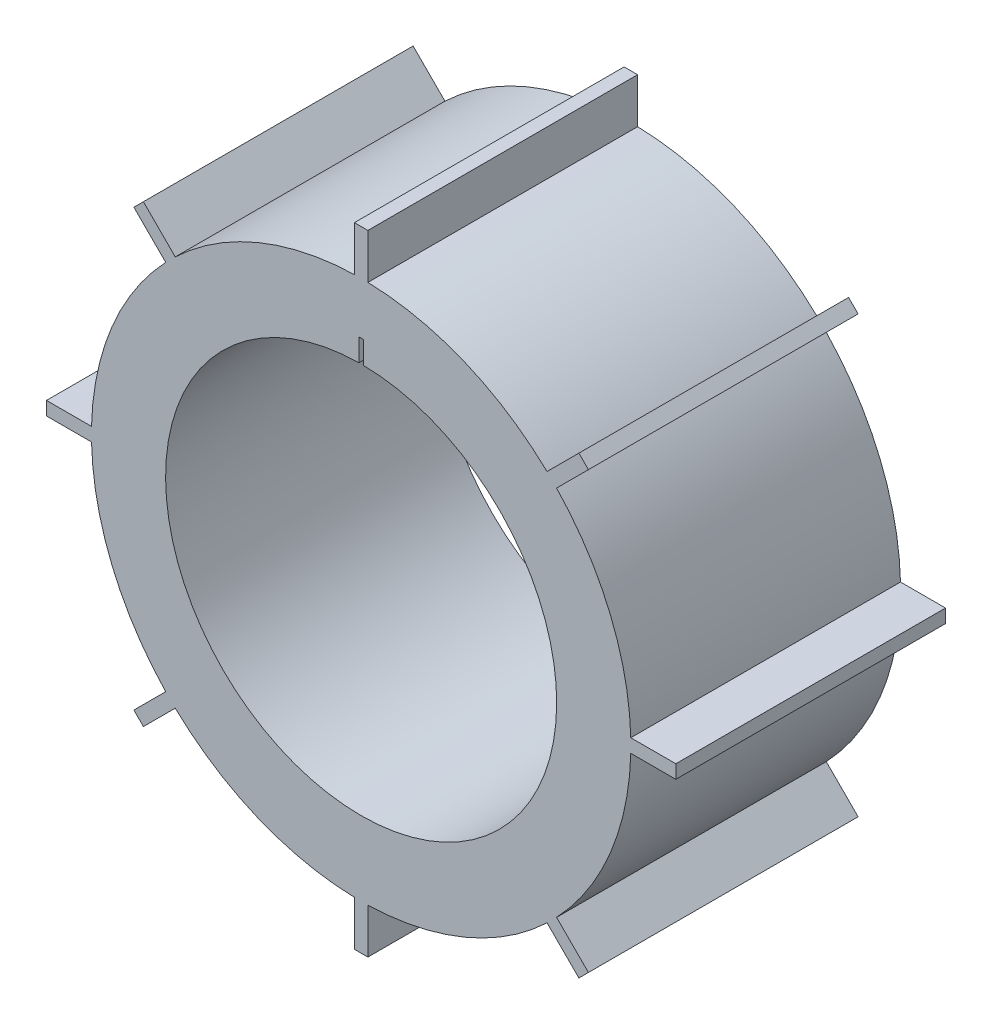
ISO-10303-21;
HEADER;
FILE_DESCRIPTION(('STEP AP214'),'2;1');
FILE_NAME('part.step','',(''),(''),'','','');
FILE_SCHEMA(('AUTOMOTIVE_DESIGN { 1 0 10303 214 1 1 1 1 }'));
ENDSEC;
DATA;
#1=APPLICATION_CONTEXT('core data for automotive mechanical design processes');
#2=APPLICATION_PROTOCOL_DEFINITION('international standard','automotive_design',2000,#1);
#3=PRODUCT_CONTEXT('',#1,'mechanical');
#4=PRODUCT('Part','Part','',(#3));
#5=PRODUCT_RELATED_PRODUCT_CATEGORY('part','',(#4));
#6=PRODUCT_DEFINITION_FORMATION('','',#4);
#7=PRODUCT_DEFINITION_CONTEXT('part definition',#1,'design');
#8=PRODUCT_DEFINITION('design','',#6,#7);
#9=PRODUCT_DEFINITION_SHAPE('','',#8);
#10=(LENGTH_UNIT() NAMED_UNIT(*) SI_UNIT(.MILLI.,.METRE.));
#11=(NAMED_UNIT(*) PLANE_ANGLE_UNIT() SI_UNIT($,.RADIAN.));
#12=(NAMED_UNIT(*) SI_UNIT($,.STERADIAN.) SOLID_ANGLE_UNIT());
#13=UNCERTAINTY_MEASURE_WITH_UNIT(LENGTH_MEASURE(1.E-05),#10,'distance_accuracy_value','');
#14=(GEOMETRIC_REPRESENTATION_CONTEXT(3) GLOBAL_UNCERTAINTY_ASSIGNED_CONTEXT((#13)) GLOBAL_UNIT_ASSIGNED_CONTEXT((#10,
#11,#12)) REPRESENTATION_CONTEXT('',''));
#15=CARTESIAN_POINT('',(0.,0.,0.));
#16=DIRECTION('',(0.,0.,1.));
#17=DIRECTION('',(1.,0.,0.));
#18=AXIS2_PLACEMENT_3D('',#15,#16,#17);
#19=CARTESIAN_POINT('',(0.,0.,60.));
#20=DIRECTION('',(0.,0.,-1.));
#21=DIRECTION('',(-1.,0.,0.));
#22=AXIS2_PLACEMENT_3D('',#19,#20,#21);
#23=CYLINDRICAL_SURFACE('',#22,60.);
#24=CARTESIAN_POINT('',(0.,0.,60.));
#25=DIRECTION('',(0.,0.,1.));
#26=DIRECTION('',(1.,0.,0.));
#27=AXIS2_PLACEMENT_3D('',#24,#25,#26);
#28=CIRCLE('',#27,60.);
#29=CARTESIAN_POINT('',(-43.4738067185754,41.3524863750168,60.));
#30=VERTEX_POINT('',#29);
#31=CARTESIAN_POINT('',(-59.9812470693966,1.50000000000063,60.));
#32=VERTEX_POINT('',#31);
#33=EDGE_CURVE('E44',#30,#32,#28,.T.);
#34=ORIENTED_EDGE('',*,*,#33,.F.);
#35=DIRECTION('',(0.,0.,1.));
#36=VECTOR('',#35,1.);
#37=CARTESIAN_POINT('',(-43.4738067185754,41.3524863750168,0.));
#38=LINE('',#37,#36);
#39=CARTESIAN_POINT('',(-43.4738067185754,41.3524863750168,0.));
#40=VERTEX_POINT('',#39);
#41=EDGE_CURVE('E300',#40,#30,#38,.T.);
#42=ORIENTED_EDGE('',*,*,#41,.F.);
#43=CARTESIAN_POINT('',(0.,0.,0.));
#44=DIRECTION('',(0.,0.,1.));
#45=DIRECTION('',(1.,0.,0.));
#46=AXIS2_PLACEMENT_3D('',#43,#44,#45);
#47=CIRCLE('',#46,60.);
#48=CARTESIAN_POINT('',(-59.9812470693966,1.50000000000063,0.));
#49=VERTEX_POINT('',#48);
#50=EDGE_CURVE('E537',#40,#49,#47,.T.);
#51=ORIENTED_EDGE('',*,*,#50,.T.);
#52=DIRECTION('',(0.,0.,1.));
#53=VECTOR('',#52,1.);
#54=CARTESIAN_POINT('',(-59.9812470693966,1.50000000000063,0.));
#55=LINE('',#54,#53);
#56=EDGE_CURVE('E315',#49,#32,#55,.T.);
#57=ORIENTED_EDGE('',*,*,#56,.T.);
#58=EDGE_LOOP('',(#34,#42,#51,#57));
#59=FACE_BOUND('',#58,.T.);
#60=ADVANCED_FACE('F35',(#59),#23,.T.);
#61=CARTESIAN_POINT('',(-59.9812470693966,-1.49999999999937,60.));
#62=VERTEX_POINT('',#61);
#63=CARTESIAN_POINT('',(-43.4738067185763,-41.3524863750159,60.));
#64=VERTEX_POINT('',#63);
#65=EDGE_CURVE('E870',#62,#64,#28,.T.);
#66=ORIENTED_EDGE('',*,*,#65,.F.);
#67=DIRECTION('',(0.,0.,1.));
#68=VECTOR('',#67,1.);
#69=CARTESIAN_POINT('',(-59.9812470693966,-1.49999999999937,0.));
#70=LINE('',#69,#68);
#71=CARTESIAN_POINT('',(-59.9812470693966,-1.49999999999937,0.));
#72=VERTEX_POINT('',#71);
#73=EDGE_CURVE('E323',#72,#62,#70,.T.);
#74=ORIENTED_EDGE('',*,*,#73,.F.);
#75=CARTESIAN_POINT('',(-43.4738067185763,-41.3524863750159,0.));
#76=VERTEX_POINT('',#75);
#77=EDGE_CURVE('E539',#72,#76,#47,.T.);
#78=ORIENTED_EDGE('',*,*,#77,.T.);
#79=DIRECTION('',(0.,0.,1.));
#80=VECTOR('',#79,1.);
#81=CARTESIAN_POINT('',(-43.4738067185763,-41.3524863750159,0.));
#82=LINE('',#81,#80);
#83=EDGE_CURVE('E342',#76,#64,#82,.T.);
#84=ORIENTED_EDGE('',*,*,#83,.T.);
#85=EDGE_LOOP('',(#66,#74,#78,#84));
#86=FACE_BOUND('',#85,.T.);
#87=ADVANCED_FACE('F593',(#86),#23,.T.);
#88=CARTESIAN_POINT('',(-41.3524863750166,-43.4738067185755,60.));
#89=VERTEX_POINT('',#88);
#90=CARTESIAN_POINT('',(-1.50000000000042,-59.9812470693966,60.));
#91=VERTEX_POINT('',#90);
#92=EDGE_CURVE('E573',#89,#91,#28,.T.);
#93=ORIENTED_EDGE('',*,*,#92,.F.);
#94=DIRECTION('',(0.,0.,1.));
#95=VECTOR('',#94,1.);
#96=CARTESIAN_POINT('',(-41.3524863750166,-43.4738067185755,0.));
#97=LINE('',#96,#95);
#98=CARTESIAN_POINT('',(-41.3524863750166,-43.4738067185755,0.));
#99=VERTEX_POINT('',#98);
#100=EDGE_CURVE('E350',#99,#89,#97,.T.);
#101=ORIENTED_EDGE('',*,*,#100,.F.);
#102=CARTESIAN_POINT('',(-1.50000000000042,-59.9812470693966,0.));
#103=VERTEX_POINT('',#102);
#104=EDGE_CURVE('E541',#99,#103,#47,.T.);
#105=ORIENTED_EDGE('',*,*,#104,.T.);
#106=DIRECTION('',(0.,0.,1.));
#107=VECTOR('',#106,1.);
#108=CARTESIAN_POINT('',(-1.50000000000042,-59.9812470693966,0.));
#109=LINE('',#108,#107);
#110=EDGE_CURVE('E370',#103,#91,#109,.T.);
#111=ORIENTED_EDGE('',*,*,#110,.T.);
#112=EDGE_LOOP('',(#93,#101,#105,#111));
#113=FACE_BOUND('',#112,.T.);
#114=ADVANCED_FACE('F597',(#113),#23,.T.);
#115=CARTESIAN_POINT('',(1.49999999999958,-59.9812470693966,60.));
#116=VERTEX_POINT('',#115);
#117=CARTESIAN_POINT('',(41.352486375016,-43.4738067185761,60.));
#118=VERTEX_POINT('',#117);
#119=EDGE_CURVE('E571',#116,#118,#28,.T.);
#120=ORIENTED_EDGE('',*,*,#119,.F.);
#121=DIRECTION('',(0.,0.,1.));
#122=VECTOR('',#121,1.);
#123=CARTESIAN_POINT('',(1.49999999999958,-59.9812470693966,0.));
#124=LINE('',#123,#122);
#125=CARTESIAN_POINT('',(1.49999999999958,-59.9812470693966,0.));
#126=VERTEX_POINT('',#125);
#127=EDGE_CURVE('E378',#126,#116,#124,.T.);
#128=ORIENTED_EDGE('',*,*,#127,.F.);
#129=CARTESIAN_POINT('',(41.352486375016,-43.4738067185761,0.));
#130=VERTEX_POINT('',#129);
#131=EDGE_CURVE('E545',#126,#130,#47,.T.);
#132=ORIENTED_EDGE('',*,*,#131,.T.);
#133=DIRECTION('',(0.,0.,1.));
#134=VECTOR('',#133,1.);
#135=CARTESIAN_POINT('',(41.352486375016,-43.4738067185761,0.));
#136=LINE('',#135,#134);
#137=EDGE_CURVE('E398',#130,#118,#136,.T.);
#138=ORIENTED_EDGE('',*,*,#137,.T.);
#139=EDGE_LOOP('',(#120,#128,#132,#138));
#140=FACE_BOUND('',#139,.T.);
#141=ADVANCED_FACE('F616',(#140),#23,.T.);
#142=CARTESIAN_POINT('',(43.4738067185757,-41.3524863750165,60.));
#143=VERTEX_POINT('',#142);
#144=CARTESIAN_POINT('',(59.9812470693966,-1.50000000000021,60.));
#145=VERTEX_POINT('',#144);
#146=EDGE_CURVE('E569',#143,#145,#28,.T.);
#147=ORIENTED_EDGE('',*,*,#146,.F.);
#148=DIRECTION('',(0.,0.,1.));
#149=VECTOR('',#148,1.);
#150=CARTESIAN_POINT('',(43.4738067185757,-41.3524863750165,0.));
#151=LINE('',#150,#149);
#152=CARTESIAN_POINT('',(43.4738067185757,-41.3524863750165,0.));
#153=VERTEX_POINT('',#152);
#154=EDGE_CURVE('E406',#153,#143,#151,.T.);
#155=ORIENTED_EDGE('',*,*,#154,.F.);
#156=CARTESIAN_POINT('',(59.9812470693966,-1.50000000000021,0.));
#157=VERTEX_POINT('',#156);
#158=EDGE_CURVE('E536',#153,#157,#47,.T.);
#159=ORIENTED_EDGE('',*,*,#158,.T.);
#160=DIRECTION('',(0.,0.,1.));
#161=VECTOR('',#160,1.);
#162=CARTESIAN_POINT('',(59.9812470693966,-1.50000000000021,0.));
#163=LINE('',#162,#161);
#164=EDGE_CURVE('E426',#157,#145,#163,.T.);
#165=ORIENTED_EDGE('',*,*,#164,.T.);
#166=EDGE_LOOP('',(#147,#155,#159,#165));
#167=FACE_BOUND('',#166,.T.);
#168=ADVANCED_FACE('F555',(#167),#23,.T.);
#169=CARTESIAN_POINT('',(59.9812470693966,1.49999999999979,60.));
#170=VERTEX_POINT('',#169);
#171=CARTESIAN_POINT('',(43.473806718576,41.3524863750162,60.));
#172=VERTEX_POINT('',#171);
#173=EDGE_CURVE('E572',#170,#172,#28,.T.);
#174=ORIENTED_EDGE('',*,*,#173,.F.);
#175=DIRECTION('',(0.,0.,1.));
#176=VECTOR('',#175,1.);
#177=CARTESIAN_POINT('',(59.9812470693966,1.49999999999979,0.));
#178=LINE('',#177,#176);
#179=CARTESIAN_POINT('',(59.9812470693966,1.49999999999979,0.));
#180=VERTEX_POINT('',#179);
#181=EDGE_CURVE('E434',#180,#170,#178,.T.);
#182=ORIENTED_EDGE('',*,*,#181,.F.);
#183=CARTESIAN_POINT('',(43.473806718576,41.3524863750162,0.));
#184=VERTEX_POINT('',#183);
#185=EDGE_CURVE('E532',#180,#184,#47,.T.);
#186=ORIENTED_EDGE('',*,*,#185,.T.);
#187=DIRECTION('',(0.,0.,1.));
#188=VECTOR('',#187,1.);
#189=CARTESIAN_POINT('',(43.473806718576,41.3524863750162,0.));
#190=LINE('',#189,#188);
#191=EDGE_CURVE('E454',#184,#172,#190,.T.);
#192=ORIENTED_EDGE('',*,*,#191,.T.);
#193=EDGE_LOOP('',(#174,#182,#186,#192));
#194=FACE_BOUND('',#193,.T.);
#195=ADVANCED_FACE('F608',(#194),#23,.T.);
#196=CARTESIAN_POINT('',(41.3524863750163,43.4738067185758,60.));
#197=VERTEX_POINT('',#196);
#198=CARTESIAN_POINT('',(1.5,59.9812470693966,60.));
#199=VERTEX_POINT('',#198);
#200=EDGE_CURVE('E46',#197,#199,#28,.T.);
#201=ORIENTED_EDGE('',*,*,#200,.F.);
#202=DIRECTION('',(0.,0.,1.));
#203=VECTOR('',#202,1.);
#204=CARTESIAN_POINT('',(41.3524863750163,43.4738067185758,0.));
#205=LINE('',#204,#203);
#206=CARTESIAN_POINT('',(41.3524863750163,43.4738067185758,0.));
#207=VERTEX_POINT('',#206);
#208=EDGE_CURVE('E462',#207,#197,#205,.T.);
#209=ORIENTED_EDGE('',*,*,#208,.F.);
#210=CARTESIAN_POINT('',(1.5,59.9812470693966,0.));
#211=VERTEX_POINT('',#210);
#212=EDGE_CURVE('E529',#207,#211,#47,.T.);
#213=ORIENTED_EDGE('',*,*,#212,.T.);
#214=DIRECTION('',(0.,0.,1.));
#215=VECTOR('',#214,1.);
#216=CARTESIAN_POINT('',(1.5,59.9812470693966,0.));
#217=LINE('',#216,#215);
#218=EDGE_CURVE('E482',#211,#199,#217,.T.);
#219=ORIENTED_EDGE('',*,*,#218,.T.);
#220=EDGE_LOOP('',(#201,#209,#213,#219));
#221=FACE_BOUND('',#220,.T.);
#222=ADVANCED_FACE('F576',(#221),#23,.T.);
#223=CARTESIAN_POINT('',(0.,0.,60.));
#224=DIRECTION('',(0.,0.,-1.));
#225=DIRECTION('',(-1.,0.,0.));
#226=AXIS2_PLACEMENT_3D('',#223,#224,#225);
#227=CYLINDRICAL_SURFACE('',#226,43.5);
#228=DIRECTION('',(0.,0.,1.));
#229=VECTOR('',#228,1.);
#230=CARTESIAN_POINT('',(0.500000000000019,43.4971263418631,0.));
#231=LINE('',#230,#229);
#232=CARTESIAN_POINT('',(0.500000000000019,43.4971263418631,0.));
#233=VERTEX_POINT('',#232);
#234=CARTESIAN_POINT('',(0.500000000000019,43.4971263418631,60.));
#235=VERTEX_POINT('',#234);
#236=EDGE_CURVE('E520',#233,#235,#231,.T.);
#237=ORIENTED_EDGE('',*,*,#236,.F.);
#238=CARTESIAN_POINT('',(0.,0.,0.));
#239=DIRECTION('',(0.,0.,1.));
#240=DIRECTION('',(1.,0.,0.));
#241=AXIS2_PLACEMENT_3D('',#238,#239,#240);
#242=CIRCLE('',#241,43.5);
#243=CARTESIAN_POINT('',(-0.50000000000001,43.4971263418631,0.));
#244=VERTEX_POINT('',#243);
#245=EDGE_CURVE('E519',#244,#233,#242,.T.);
#246=ORIENTED_EDGE('',*,*,#245,.F.);
#247=DIRECTION('',(0.,0.,1.));
#248=VECTOR('',#247,1.);
#249=CARTESIAN_POINT('',(-0.50000000000001,43.4971263418632,0.));
#250=LINE('',#249,#248);
#251=CARTESIAN_POINT('',(-0.50000000000001,43.4971263418632,60.));
#252=VERTEX_POINT('',#251);
#253=EDGE_CURVE('E522',#244,#252,#250,.T.);
#254=ORIENTED_EDGE('',*,*,#253,.T.);
#255=CARTESIAN_POINT('',(0.,0.,60.));
#256=DIRECTION('',(0.,0.,1.));
#257=DIRECTION('',(1.,0.,0.));
#258=AXIS2_PLACEMENT_3D('',#255,#256,#257);
#259=CIRCLE('',#258,43.5);
#260=EDGE_CURVE('E526',#252,#235,#259,.T.);
#261=ORIENTED_EDGE('',*,*,#260,.T.);
#262=EDGE_LOOP('',(#237,#246,#254,#261));
#263=FACE_BOUND('',#262,.T.);
#264=ADVANCED_FACE('F37',(#263),#227,.F.);
#265=CARTESIAN_POINT('',(-1.5,59.9812470693966,0.));
#266=VERTEX_POINT('',#265);
#267=CARTESIAN_POINT('',(-41.3524863750157,43.4738067185764,0.));
#268=VERTEX_POINT('',#267);
#269=EDGE_CURVE('E39',#266,#268,#47,.T.);
#270=ORIENTED_EDGE('',*,*,#269,.T.);
#271=DIRECTION('',(0.,0.,1.));
#272=VECTOR('',#271,1.);
#273=CARTESIAN_POINT('',(-41.3524863750157,43.4738067185764,0.));
#274=LINE('',#273,#272);
#275=CARTESIAN_POINT('',(-41.3524863750157,43.4738067185764,60.));
#276=VERTEX_POINT('',#275);
#277=EDGE_CURVE('E60',#268,#276,#274,.T.);
#278=ORIENTED_EDGE('',*,*,#277,.T.);
#279=CARTESIAN_POINT('',(-1.5,59.9812470693966,60.));
#280=VERTEX_POINT('',#279);
#281=EDGE_CURVE('E11',#280,#276,#28,.T.);
#282=ORIENTED_EDGE('',*,*,#281,.F.);
#283=DIRECTION('',(0.,0.,1.));
#284=VECTOR('',#283,1.);
#285=CARTESIAN_POINT('',(-1.5,59.9812470693966,0.));
#286=LINE('',#285,#284);
#287=EDGE_CURVE('E490',#266,#280,#286,.T.);
#288=ORIENTED_EDGE('',*,*,#287,.F.);
#289=EDGE_LOOP('',(#270,#278,#282,#288));
#290=FACE_BOUND('',#289,.T.);
#291=ADVANCED_FACE('F588',(#290),#23,.T.);
#292=CARTESIAN_POINT('',(0.,0.,60.));
#293=DIRECTION('',(0.,0.,1.));
#294=DIRECTION('',(1.,0.,0.));
#295=AXIS2_PLACEMENT_3D('',#292,#293,#294);
#296=PLANE('',#295);
#297=DIRECTION('',(0.,1.,0.));
#298=VECTOR('',#297,1.);
#299=CARTESIAN_POINT('',(0.500000000000018,43.4971263418631,60.));
#300=LINE('',#299,#298);
#301=CARTESIAN_POINT('',(0.5,48.5,60.));
#302=VERTEX_POINT('',#301);
#303=EDGE_CURVE('E504',#235,#302,#300,.T.);
#304=ORIENTED_EDGE('',*,*,#303,.F.);
#305=ORIENTED_EDGE('',*,*,#260,.F.);
#306=DIRECTION('',(0.,-1.,0.));
#307=VECTOR('',#306,1.);
#308=CARTESIAN_POINT('',(-0.5,48.5,60.));
#309=LINE('',#308,#307);
#310=CARTESIAN_POINT('',(-0.5,48.5,60.));
#311=VERTEX_POINT('',#310);
#312=EDGE_CURVE('E513',#311,#252,#309,.T.);
#313=ORIENTED_EDGE('',*,*,#312,.F.);
#314=DIRECTION('',(-1.,0.,0.));
#315=VECTOR('',#314,1.);
#316=CARTESIAN_POINT('',(0.5,48.5,60.));
#317=LINE('',#316,#315);
#318=EDGE_CURVE('E493',#302,#311,#317,.T.);
#319=ORIENTED_EDGE('',*,*,#318,.F.);
#320=EDGE_LOOP('',(#304,#305,#313,#319));
#321=FACE_BOUND('',#320,.T.);
#322=ORIENTED_EDGE('',*,*,#281,.T.);
#323=DIRECTION('',(-0.707106781186548,0.707106781186548,0.));
#324=VECTOR('',#323,1.);
#325=CARTESIAN_POINT('',(-41.3524863750157,43.4738067185764,60.));
#326=LINE('',#325,#324);
#327=CARTESIAN_POINT('',(-48.4368145112802,50.5581348548409,60.));
#328=VERTEX_POINT('',#327);
#329=EDGE_CURVE('E297',#276,#328,#326,.T.);
#330=ORIENTED_EDGE('',*,*,#329,.T.);
#331=DIRECTION('',(-0.707106781186548,-0.707106781186548,0.));
#332=VECTOR('',#331,1.);
#333=CARTESIAN_POINT('',(-50.5581348548399,48.4368145112812,60.));
#334=LINE('',#333,#332);
#335=CARTESIAN_POINT('',(-50.5581348548399,48.4368145112812,60.));
#336=VERTEX_POINT('',#335);
#337=EDGE_CURVE('E276',#328,#336,#334,.T.);
#338=ORIENTED_EDGE('',*,*,#337,.T.);
#339=DIRECTION('',(0.707106781186547,-0.707106781186547,0.));
#340=VECTOR('',#339,1.);
#341=CARTESIAN_POINT('',(-43.4738067185754,41.3524863750168,60.));
#342=LINE('',#341,#340);
#343=EDGE_CURVE('E291',#336,#30,#342,.T.);
#344=ORIENTED_EDGE('',*,*,#343,.T.);
#345=ORIENTED_EDGE('',*,*,#33,.T.);
#346=DIRECTION('',(-1.,0.,0.));
#347=VECTOR('',#346,1.);
#348=CARTESIAN_POINT('',(-59.9812470693966,1.50000000000063,60.));
#349=LINE('',#348,#347);
#350=CARTESIAN_POINT('',(-70.0000000000031,1.50000000000073,60.));
#351=VERTEX_POINT('',#350);
#352=EDGE_CURVE('E302',#32,#351,#349,.T.);
#353=ORIENTED_EDGE('',*,*,#352,.T.);
#354=DIRECTION('',(0.,-1.,0.));
#355=VECTOR('',#354,1.);
#356=CARTESIAN_POINT('',(-70.0000000000031,-1.49999999999926,60.));
#357=LINE('',#356,#355);
#358=CARTESIAN_POINT('',(-70.0000000000031,-1.49999999999926,60.));
#359=VERTEX_POINT('',#358);
#360=EDGE_CURVE('E318',#351,#359,#357,.T.);
#361=ORIENTED_EDGE('',*,*,#360,.T.);
#362=DIRECTION('',(1.,0.,0.));
#363=VECTOR('',#362,1.);
#364=CARTESIAN_POINT('',(-59.9812470693966,-1.49999999999937,60.));
#365=LINE('',#364,#363);
#366=EDGE_CURVE('E309',#359,#62,#365,.T.);
#367=ORIENTED_EDGE('',*,*,#366,.T.);
#368=ORIENTED_EDGE('',*,*,#65,.T.);
#369=DIRECTION('',(-0.707106781186563,-0.707106781186532,0.));
#370=VECTOR('',#369,1.);
#371=CARTESIAN_POINT('',(-43.4738067185763,-41.3524863750159,60.));
#372=LINE('',#371,#370);
#373=CARTESIAN_POINT('',(-50.5581348548409,-48.4368145112802,60.));
#374=VERTEX_POINT('',#373);
#375=EDGE_CURVE('E326',#64,#374,#372,.T.);
#376=ORIENTED_EDGE('',*,*,#375,.T.);
#377=DIRECTION('',(0.707106781186547,-0.707106781186547,0.));
#378=VECTOR('',#377,1.);
#379=CARTESIAN_POINT('',(-48.4368145112812,-50.5581348548399,60.));
#380=LINE('',#379,#378);
#381=CARTESIAN_POINT('',(-48.4368145112812,-50.5581348548399,60.));
#382=VERTEX_POINT('',#381);
#383=EDGE_CURVE('E345',#374,#382,#380,.T.);
#384=ORIENTED_EDGE('',*,*,#383,.T.);
#385=DIRECTION('',(0.707106781186562,0.707106781186533,0.));
#386=VECTOR('',#385,1.);
#387=CARTESIAN_POINT('',(-41.3524863750166,-43.4738067185755,60.));
#388=LINE('',#387,#386);
#389=EDGE_CURVE('E336',#382,#89,#388,.T.);
#390=ORIENTED_EDGE('',*,*,#389,.T.);
#391=ORIENTED_EDGE('',*,*,#92,.T.);
#392=DIRECTION('',(0.,-1.,0.));
#393=VECTOR('',#392,1.);
#394=CARTESIAN_POINT('',(-1.50000000000042,-59.9812470693966,60.));
#395=LINE('',#394,#393);
#396=CARTESIAN_POINT('',(-1.50000000000074,-70.0000000000031,60.));
#397=VERTEX_POINT('',#396);
#398=EDGE_CURVE('E353',#91,#397,#395,.T.);
#399=ORIENTED_EDGE('',*,*,#398,.T.);
#400=DIRECTION('',(1.,0.,0.));
#401=VECTOR('',#400,1.);
#402=CARTESIAN_POINT('',(1.49999999999926,-70.0000000000031,60.));
#403=LINE('',#402,#401);
#404=CARTESIAN_POINT('',(1.49999999999926,-70.0000000000031,60.));
#405=VERTEX_POINT('',#404);
#406=EDGE_CURVE('E373',#397,#405,#403,.T.);
#407=ORIENTED_EDGE('',*,*,#406,.T.);
#408=DIRECTION('',(0.,1.,0.));
#409=VECTOR('',#408,1.);
#410=CARTESIAN_POINT('',(1.49999999999958,-59.9812470693966,60.));
#411=LINE('',#410,#409);
#412=EDGE_CURVE('E364',#405,#116,#411,.T.);
#413=ORIENTED_EDGE('',*,*,#412,.T.);
#414=ORIENTED_EDGE('',*,*,#119,.T.);
#415=DIRECTION('',(0.707106781186517,-0.707106781186578,0.));
#416=VECTOR('',#415,1.);
#417=CARTESIAN_POINT('',(41.352486375016,-43.4738067185761,60.));
#418=LINE('',#417,#416);
#419=CARTESIAN_POINT('',(48.4368145112802,-50.5581348548409,60.));
#420=VERTEX_POINT('',#419);
#421=EDGE_CURVE('E381',#118,#420,#418,.T.);
#422=ORIENTED_EDGE('',*,*,#421,.T.);
#423=DIRECTION('',(0.707106781186547,0.707106781186547,0.));
#424=VECTOR('',#423,1.);
#425=CARTESIAN_POINT('',(50.5581348548398,-48.4368145112812,60.));
#426=LINE('',#425,#424);
#427=CARTESIAN_POINT('',(50.5581348548398,-48.4368145112812,60.));
#428=VERTEX_POINT('',#427);
#429=EDGE_CURVE('E401',#420,#428,#426,.T.);
#430=ORIENTED_EDGE('',*,*,#429,.T.);
#431=DIRECTION('',(-0.707106781186518,0.707106781186577,0.));
#432=VECTOR('',#431,1.);
#433=CARTESIAN_POINT('',(43.4738067185757,-41.3524863750165,60.));
#434=LINE('',#433,#432);
#435=EDGE_CURVE('E392',#428,#143,#434,.T.);
#436=ORIENTED_EDGE('',*,*,#435,.T.);
#437=ORIENTED_EDGE('',*,*,#146,.T.);
#438=DIRECTION('',(1.,0.,0.));
#439=VECTOR('',#438,1.);
#440=CARTESIAN_POINT('',(59.9812470693966,-1.50000000000021,60.));
#441=LINE('',#440,#439);
#442=CARTESIAN_POINT('',(70.0000000000031,-1.50000000000074,60.));
#443=VERTEX_POINT('',#442);
#444=EDGE_CURVE('E409',#145,#443,#441,.T.);
#445=ORIENTED_EDGE('',*,*,#444,.T.);
#446=DIRECTION('',(0.,1.,0.));
#447=VECTOR('',#446,1.);
#448=CARTESIAN_POINT('',(70.0000000000031,1.49999999999926,60.));
#449=LINE('',#448,#447);
#450=CARTESIAN_POINT('',(70.0000000000031,1.49999999999926,60.));
#451=VERTEX_POINT('',#450);
#452=EDGE_CURVE('E429',#443,#451,#449,.T.);
#453=ORIENTED_EDGE('',*,*,#452,.T.);
#454=DIRECTION('',(-1.,0.,0.));
#455=VECTOR('',#454,1.);
#456=CARTESIAN_POINT('',(59.9812470693966,1.49999999999979,60.));
#457=LINE('',#456,#455);
#458=EDGE_CURVE('E420',#451,#170,#457,.T.);
#459=ORIENTED_EDGE('',*,*,#458,.T.);
#460=ORIENTED_EDGE('',*,*,#173,.T.);
#461=DIRECTION('',(0.707106781186593,0.707106781186502,0.));
#462=VECTOR('',#461,1.);
#463=CARTESIAN_POINT('',(43.473806718576,41.3524863750162,60.));
#464=LINE('',#463,#462);
#465=CARTESIAN_POINT('',(50.5581348548409,48.4368145112802,60.));
#466=VERTEX_POINT('',#465);
#467=EDGE_CURVE('E437',#172,#466,#464,.T.);
#468=ORIENTED_EDGE('',*,*,#467,.T.);
#469=DIRECTION('',(-0.707106781186547,0.707106781186547,0.));
#470=VECTOR('',#469,1.);
#471=CARTESIAN_POINT('',(48.4368145112813,50.5581348548398,60.));
#472=LINE('',#471,#470);
#473=CARTESIAN_POINT('',(48.4368145112813,50.5581348548398,60.));
#474=VERTEX_POINT('',#473);
#475=EDGE_CURVE('E457',#466,#474,#472,.T.);
#476=ORIENTED_EDGE('',*,*,#475,.T.);
#477=DIRECTION('',(-0.707106781186592,-0.707106781186503,0.));
#478=VECTOR('',#477,1.);
#479=CARTESIAN_POINT('',(41.3524863750163,43.4738067185758,60.));
#480=LINE('',#479,#478);
#481=EDGE_CURVE('E448',#474,#197,#480,.T.);
#482=ORIENTED_EDGE('',*,*,#481,.T.);
#483=ORIENTED_EDGE('',*,*,#200,.T.);
#484=DIRECTION('',(0.,1.,0.));
#485=VECTOR('',#484,1.);
#486=CARTESIAN_POINT('',(1.5,59.9812470693966,60.));
#487=LINE('',#486,#485);
#488=CARTESIAN_POINT('',(1.50000000000075,70.0000000000031,60.));
#489=VERTEX_POINT('',#488);
#490=EDGE_CURVE('E465',#199,#489,#487,.T.);
#491=ORIENTED_EDGE('',*,*,#490,.T.);
#492=DIRECTION('',(-1.,0.,0.));
#493=VECTOR('',#492,1.);
#494=CARTESIAN_POINT('',(-1.49999999999925,70.0000000000031,60.));
#495=LINE('',#494,#493);
#496=CARTESIAN_POINT('',(-1.49999999999925,70.0000000000031,60.));
#497=VERTEX_POINT('',#496);
#498=EDGE_CURVE('E485',#489,#497,#495,.T.);
#499=ORIENTED_EDGE('',*,*,#498,.T.);
#500=DIRECTION('',(0.,-1.,0.));
#501=VECTOR('',#500,1.);
#502=CARTESIAN_POINT('',(-1.5,59.9812470693966,60.));
#503=LINE('',#502,#501);
#504=EDGE_CURVE('E476',#497,#280,#503,.T.);
#505=ORIENTED_EDGE('',*,*,#504,.T.);
#506=EDGE_LOOP('',(#322,#330,#338,#344,#345,#353,#361,#367,#368,#376,#384,#390,#391,#399,#407,
#413,#414,#422,#430,#436,#437,#445,#453,#459,#460,#468,#476,#482,#483,#491,#499,#505));
#507=FACE_BOUND('',#506,.T.);
#508=ADVANCED_FACE('F568',(#321,#507),#296,.T.);
#509=CARTESIAN_POINT('',(0.,0.,0.));
#510=DIRECTION('',(0.,0.,1.));
#511=DIRECTION('',(1.,0.,0.));
#512=AXIS2_PLACEMENT_3D('',#509,#510,#511);
#513=PLANE('',#512);
#514=ORIENTED_EDGE('',*,*,#245,.T.);
#515=DIRECTION('',(0.,1.,0.));
#516=VECTOR('',#515,1.);
#517=CARTESIAN_POINT('',(0.500000000000018,43.4971263418631,0.));
#518=LINE('',#517,#516);
#519=CARTESIAN_POINT('',(0.5,48.5,0.));
#520=VERTEX_POINT('',#519);
#521=EDGE_CURVE('E507',#233,#520,#518,.T.);
#522=ORIENTED_EDGE('',*,*,#521,.T.);
#523=DIRECTION('',(-1.,0.,0.));
#524=VECTOR('',#523,1.);
#525=CARTESIAN_POINT('',(0.5,48.5,0.));
#526=LINE('',#525,#524);
#527=CARTESIAN_POINT('',(-0.5,48.5,0.));
#528=VERTEX_POINT('',#527);
#529=EDGE_CURVE('E500',#520,#528,#526,.T.);
#530=ORIENTED_EDGE('',*,*,#529,.T.);
#531=DIRECTION('',(0.,-1.,0.));
#532=VECTOR('',#531,1.);
#533=CARTESIAN_POINT('',(-0.5,48.5,0.));
#534=LINE('',#533,#532);
#535=EDGE_CURVE('E503',#528,#244,#534,.T.);
#536=ORIENTED_EDGE('',*,*,#535,.T.);
#537=EDGE_LOOP('',(#514,#522,#530,#536));
#538=FACE_BOUND('',#537,.T.);
#539=ORIENTED_EDGE('',*,*,#269,.F.);
#540=DIRECTION('',(0.,-1.,0.));
#541=VECTOR('',#540,1.);
#542=CARTESIAN_POINT('',(-1.5,59.9812470693966,0.));
#543=LINE('',#542,#541);
#544=CARTESIAN_POINT('',(-1.49999999999925,70.0000000000031,0.));
#545=VERTEX_POINT('',#544);
#546=EDGE_CURVE('E479',#545,#266,#543,.T.);
#547=ORIENTED_EDGE('',*,*,#546,.F.);
#548=DIRECTION('',(-1.,0.,0.));
#549=VECTOR('',#548,1.);
#550=CARTESIAN_POINT('',(-1.49999999999925,70.0000000000031,0.));
#551=LINE('',#550,#549);
#552=CARTESIAN_POINT('',(1.50000000000075,70.0000000000031,0.));
#553=VERTEX_POINT('',#552);
#554=EDGE_CURVE('E475',#553,#545,#551,.T.);
#555=ORIENTED_EDGE('',*,*,#554,.F.);
#556=DIRECTION('',(0.,1.,0.));
#557=VECTOR('',#556,1.);
#558=CARTESIAN_POINT('',(1.5,59.9812470693966,0.));
#559=LINE('',#558,#557);
#560=EDGE_CURVE('E472',#211,#553,#559,.T.);
#561=ORIENTED_EDGE('',*,*,#560,.F.);
#562=ORIENTED_EDGE('',*,*,#212,.F.);
#563=DIRECTION('',(-0.707106781186592,-0.707106781186503,0.));
#564=VECTOR('',#563,1.);
#565=CARTESIAN_POINT('',(41.3524863750163,43.4738067185758,0.));
#566=LINE('',#565,#564);
#567=CARTESIAN_POINT('',(48.4368145112813,50.5581348548398,0.));
#568=VERTEX_POINT('',#567);
#569=EDGE_CURVE('E451',#568,#207,#566,.T.);
#570=ORIENTED_EDGE('',*,*,#569,.F.);
#571=DIRECTION('',(-0.707106781186547,0.707106781186547,0.));
#572=VECTOR('',#571,1.);
#573=CARTESIAN_POINT('',(48.4368145112813,50.5581348548398,0.));
#574=LINE('',#573,#572);
#575=CARTESIAN_POINT('',(50.5581348548409,48.4368145112802,0.));
#576=VERTEX_POINT('',#575);
#577=EDGE_CURVE('E447',#576,#568,#574,.T.);
#578=ORIENTED_EDGE('',*,*,#577,.F.);
#579=DIRECTION('',(0.707106781186593,0.707106781186502,0.));
#580=VECTOR('',#579,1.);
#581=CARTESIAN_POINT('',(43.473806718576,41.3524863750162,0.));
#582=LINE('',#581,#580);
#583=EDGE_CURVE('E444',#184,#576,#582,.T.);
#584=ORIENTED_EDGE('',*,*,#583,.F.);
#585=ORIENTED_EDGE('',*,*,#185,.F.);
#586=DIRECTION('',(-1.,0.,0.));
#587=VECTOR('',#586,1.);
#588=CARTESIAN_POINT('',(59.9812470693966,1.49999999999979,0.));
#589=LINE('',#588,#587);
#590=CARTESIAN_POINT('',(70.0000000000031,1.49999999999926,0.));
#591=VERTEX_POINT('',#590);
#592=EDGE_CURVE('E423',#591,#180,#589,.T.);
#593=ORIENTED_EDGE('',*,*,#592,.F.);
#594=DIRECTION('',(0.,1.,0.));
#595=VECTOR('',#594,1.);
#596=CARTESIAN_POINT('',(70.0000000000031,1.49999999999926,0.));
#597=LINE('',#596,#595);
#598=CARTESIAN_POINT('',(70.0000000000031,-1.50000000000074,0.));
#599=VERTEX_POINT('',#598);
#600=EDGE_CURVE('E419',#599,#591,#597,.T.);
#601=ORIENTED_EDGE('',*,*,#600,.F.);
#602=DIRECTION('',(1.,0.,0.));
#603=VECTOR('',#602,1.);
#604=CARTESIAN_POINT('',(59.9812470693966,-1.50000000000021,0.));
#605=LINE('',#604,#603);
#606=EDGE_CURVE('E416',#157,#599,#605,.T.);
#607=ORIENTED_EDGE('',*,*,#606,.F.);
#608=ORIENTED_EDGE('',*,*,#158,.F.);
#609=DIRECTION('',(-0.707106781186518,0.707106781186577,0.));
#610=VECTOR('',#609,1.);
#611=CARTESIAN_POINT('',(43.4738067185757,-41.3524863750165,0.));
#612=LINE('',#611,#610);
#613=CARTESIAN_POINT('',(50.5581348548398,-48.4368145112812,0.));
#614=VERTEX_POINT('',#613);
#615=EDGE_CURVE('E395',#614,#153,#612,.T.);
#616=ORIENTED_EDGE('',*,*,#615,.F.);
#617=DIRECTION('',(0.707106781186547,0.707106781186547,0.));
#618=VECTOR('',#617,1.);
#619=CARTESIAN_POINT('',(50.5581348548398,-48.4368145112812,0.));
#620=LINE('',#619,#618);
#621=CARTESIAN_POINT('',(48.4368145112802,-50.5581348548409,0.));
#622=VERTEX_POINT('',#621);
#623=EDGE_CURVE('E391',#622,#614,#620,.T.);
#624=ORIENTED_EDGE('',*,*,#623,.F.);
#625=DIRECTION('',(0.707106781186517,-0.707106781186578,0.));
#626=VECTOR('',#625,1.);
#627=CARTESIAN_POINT('',(41.352486375016,-43.4738067185761,0.));
#628=LINE('',#627,#626);
#629=EDGE_CURVE('E388',#130,#622,#628,.T.);
#630=ORIENTED_EDGE('',*,*,#629,.F.);
#631=ORIENTED_EDGE('',*,*,#131,.F.);
#632=DIRECTION('',(0.,1.,0.));
#633=VECTOR('',#632,1.);
#634=CARTESIAN_POINT('',(1.49999999999958,-59.9812470693966,0.));
#635=LINE('',#634,#633);
#636=CARTESIAN_POINT('',(1.49999999999926,-70.0000000000031,0.));
#637=VERTEX_POINT('',#636);
#638=EDGE_CURVE('E367',#637,#126,#635,.T.);
#639=ORIENTED_EDGE('',*,*,#638,.F.);
#640=DIRECTION('',(1.,0.,0.));
#641=VECTOR('',#640,1.);
#642=CARTESIAN_POINT('',(1.49999999999926,-70.0000000000031,0.));
#643=LINE('',#642,#641);
#644=CARTESIAN_POINT('',(-1.50000000000074,-70.0000000000031,0.));
#645=VERTEX_POINT('',#644);
#646=EDGE_CURVE('E363',#645,#637,#643,.T.);
#647=ORIENTED_EDGE('',*,*,#646,.F.);
#648=DIRECTION('',(0.,-1.,0.));
#649=VECTOR('',#648,1.);
#650=CARTESIAN_POINT('',(-1.50000000000042,-59.9812470693966,0.));
#651=LINE('',#650,#649);
#652=EDGE_CURVE('E360',#103,#645,#651,.T.);
#653=ORIENTED_EDGE('',*,*,#652,.F.);
#654=ORIENTED_EDGE('',*,*,#104,.F.);
#655=DIRECTION('',(0.707106781186562,0.707106781186533,0.));
#656=VECTOR('',#655,1.);
#657=CARTESIAN_POINT('',(-41.3524863750166,-43.4738067185755,0.));
#658=LINE('',#657,#656);
#659=CARTESIAN_POINT('',(-48.4368145112812,-50.5581348548399,0.));
#660=VERTEX_POINT('',#659);
#661=EDGE_CURVE('E339',#660,#99,#658,.T.);
#662=ORIENTED_EDGE('',*,*,#661,.F.);
#663=DIRECTION('',(0.707106781186547,-0.707106781186547,0.));
#664=VECTOR('',#663,1.);
#665=CARTESIAN_POINT('',(-48.4368145112812,-50.5581348548399,0.));
#666=LINE('',#665,#664);
#667=CARTESIAN_POINT('',(-50.5581348548409,-48.4368145112802,0.));
#668=VERTEX_POINT('',#667);
#669=EDGE_CURVE('E335',#668,#660,#666,.T.);
#670=ORIENTED_EDGE('',*,*,#669,.F.);
#671=DIRECTION('',(-0.707106781186563,-0.707106781186532,0.));
#672=VECTOR('',#671,1.);
#673=CARTESIAN_POINT('',(-43.4738067185763,-41.3524863750159,0.));
#674=LINE('',#673,#672);
#675=EDGE_CURVE('E332',#76,#668,#674,.T.);
#676=ORIENTED_EDGE('',*,*,#675,.F.);
#677=ORIENTED_EDGE('',*,*,#77,.F.);
#678=DIRECTION('',(1.,0.,0.));
#679=VECTOR('',#678,1.);
#680=CARTESIAN_POINT('',(-59.9812470693966,-1.49999999999937,0.));
#681=LINE('',#680,#679);
#682=CARTESIAN_POINT('',(-70.0000000000031,-1.49999999999926,0.));
#683=VERTEX_POINT('',#682);
#684=EDGE_CURVE('E312',#683,#72,#681,.T.);
#685=ORIENTED_EDGE('',*,*,#684,.F.);
#686=DIRECTION('',(0.,-1.,0.));
#687=VECTOR('',#686,1.);
#688=CARTESIAN_POINT('',(-70.0000000000031,-1.49999999999926,0.));
#689=LINE('',#688,#687);
#690=CARTESIAN_POINT('',(-70.0000000000031,1.50000000000073,0.));
#691=VERTEX_POINT('',#690);
#692=EDGE_CURVE('E308',#691,#683,#689,.T.);
#693=ORIENTED_EDGE('',*,*,#692,.F.);
#694=DIRECTION('',(-1.,0.,0.));
#695=VECTOR('',#694,1.);
#696=CARTESIAN_POINT('',(-59.9812470693966,1.50000000000063,0.));
#697=LINE('',#696,#695);
#698=EDGE_CURVE('E305',#49,#691,#697,.T.);
#699=ORIENTED_EDGE('',*,*,#698,.F.);
#700=ORIENTED_EDGE('',*,*,#50,.F.);
#701=DIRECTION('',(0.707106781186547,-0.707106781186547,0.));
#702=VECTOR('',#701,1.);
#703=CARTESIAN_POINT('',(-43.4738067185754,41.3524863750168,0.));
#704=LINE('',#703,#702);
#705=CARTESIAN_POINT('',(-50.5581348548399,48.4368145112812,0.));
#706=VERTEX_POINT('',#705);
#707=EDGE_CURVE('E288',#706,#40,#704,.T.);
#708=ORIENTED_EDGE('',*,*,#707,.F.);
#709=DIRECTION('',(-0.707106781186548,-0.707106781186548,0.));
#710=VECTOR('',#709,1.);
#711=CARTESIAN_POINT('',(-50.5581348548399,48.4368145112812,0.));
#712=LINE('',#711,#710);
#713=CARTESIAN_POINT('',(-48.4368145112802,50.5581348548409,0.));
#714=VERTEX_POINT('',#713);
#715=EDGE_CURVE('E273',#714,#706,#712,.T.);
#716=ORIENTED_EDGE('',*,*,#715,.F.);
#717=DIRECTION('',(-0.707106781186548,0.707106781186548,0.));
#718=VECTOR('',#717,1.);
#719=CARTESIAN_POINT('',(-41.3524863750157,43.4738067185764,0.));
#720=LINE('',#719,#718);
#721=EDGE_CURVE('E286',#268,#714,#720,.T.);
#722=ORIENTED_EDGE('',*,*,#721,.F.);
#723=EDGE_LOOP('',(#539,#547,#555,#561,#562,#570,#578,#584,#585,#593,#601,#607,#608,#616,#624,
#630,#631,#639,#647,#653,#654,#662,#670,#676,#677,#685,#693,#699,#700,#708,#716,#722));
#724=FACE_BOUND('',#723,.T.);
#725=ADVANCED_FACE('F285',(#538,#724),#513,.F.);
#726=CARTESIAN_POINT('',(0.5,48.5,0.));
#727=DIRECTION('',(0.,1.,0.));
#728=DIRECTION('',(0.,0.,1.));
#729=AXIS2_PLACEMENT_3D('',#726,#727,#728);
#730=PLANE('',#729);
#731=ORIENTED_EDGE('',*,*,#318,.T.);
#732=DIRECTION('',(0.,0.,1.));
#733=VECTOR('',#732,1.);
#734=CARTESIAN_POINT('',(-0.5,48.5,0.));
#735=LINE('',#734,#733);
#736=EDGE_CURVE('E510',#528,#311,#735,.T.);
#737=ORIENTED_EDGE('',*,*,#736,.F.);
#738=ORIENTED_EDGE('',*,*,#529,.F.);
#739=DIRECTION('',(0.,0.,1.));
#740=VECTOR('',#739,1.);
#741=CARTESIAN_POINT('',(0.5,48.5,0.));
#742=LINE('',#741,#740);
#743=EDGE_CURVE('E517',#520,#302,#742,.T.);
#744=ORIENTED_EDGE('',*,*,#743,.T.);
#745=EDGE_LOOP('',(#731,#737,#738,#744));
#746=FACE_BOUND('',#745,.T.);
#747=ADVANCED_FACE('F657',(#746),#730,.F.);
#748=CARTESIAN_POINT('',(0.500000000000018,43.4971263418631,0.));
#749=DIRECTION('',(1.,0.,0.));
#750=DIRECTION('',(0.,1.,0.));
#751=AXIS2_PLACEMENT_3D('',#748,#749,#750);
#752=PLANE('',#751);
#753=ORIENTED_EDGE('',*,*,#303,.T.);
#754=ORIENTED_EDGE('',*,*,#743,.F.);
#755=ORIENTED_EDGE('',*,*,#521,.F.);
#756=ORIENTED_EDGE('',*,*,#236,.T.);
#757=EDGE_LOOP('',(#753,#754,#755,#756));
#758=FACE_BOUND('',#757,.T.);
#759=ADVANCED_FACE('F654',(#758),#752,.F.);
#760=CARTESIAN_POINT('',(-0.5,48.5,0.));
#761=DIRECTION('',(-1.,0.,0.));
#762=DIRECTION('',(0.,-1.,0.));
#763=AXIS2_PLACEMENT_3D('',#760,#761,#762);
#764=PLANE('',#763);
#765=ORIENTED_EDGE('',*,*,#312,.T.);
#766=ORIENTED_EDGE('',*,*,#253,.F.);
#767=ORIENTED_EDGE('',*,*,#535,.F.);
#768=ORIENTED_EDGE('',*,*,#736,.T.);
#769=EDGE_LOOP('',(#765,#766,#767,#768));
#770=FACE_BOUND('',#769,.T.);
#771=ADVANCED_FACE('F649',(#770),#764,.F.);
#772=CARTESIAN_POINT('',(-1.5,59.9812470693966,0.));
#773=DIRECTION('',(-1.,0.,0.));
#774=DIRECTION('',(0.,-1.,0.));
#775=AXIS2_PLACEMENT_3D('',#772,#773,#774);
#776=PLANE('',#775);
#777=ORIENTED_EDGE('',*,*,#504,.F.);
#778=DIRECTION('',(0.,0.,1.));
#779=VECTOR('',#778,1.);
#780=CARTESIAN_POINT('',(-1.49999999999925,70.0000000000031,0.));
#781=LINE('',#780,#779);
#782=EDGE_CURVE('E494',#545,#497,#781,.T.);
#783=ORIENTED_EDGE('',*,*,#782,.F.);
#784=ORIENTED_EDGE('',*,*,#546,.T.);
#785=ORIENTED_EDGE('',*,*,#287,.T.);
#786=EDGE_LOOP('',(#777,#783,#784,#785));
#787=FACE_BOUND('',#786,.T.);
#788=ADVANCED_FACE('F586',(#787),#776,.T.);
#789=CARTESIAN_POINT('',(-1.49999999999925,70.0000000000031,0.));
#790=DIRECTION('',(0.,1.,0.));
#791=DIRECTION('',(0.,0.,1.));
#792=AXIS2_PLACEMENT_3D('',#789,#790,#791);
#793=PLANE('',#792);
#794=ORIENTED_EDGE('',*,*,#498,.F.);
#795=DIRECTION('',(0.,0.,1.));
#796=VECTOR('',#795,1.);
#797=CARTESIAN_POINT('',(1.50000000000075,70.0000000000031,0.));
#798=LINE('',#797,#796);
#799=EDGE_CURVE('E496',#553,#489,#798,.T.);
#800=ORIENTED_EDGE('',*,*,#799,.F.);
#801=ORIENTED_EDGE('',*,*,#554,.T.);
#802=ORIENTED_EDGE('',*,*,#782,.T.);
#803=EDGE_LOOP('',(#794,#800,#801,#802));
#804=FACE_BOUND('',#803,.T.);
#805=ADVANCED_FACE('F583',(#804),#793,.T.);
#806=CARTESIAN_POINT('',(1.5,59.9812470693966,0.));
#807=DIRECTION('',(1.,0.,0.));
#808=DIRECTION('',(0.,1.,0.));
#809=AXIS2_PLACEMENT_3D('',#806,#807,#808);
#810=PLANE('',#809);
#811=ORIENTED_EDGE('',*,*,#490,.F.);
#812=ORIENTED_EDGE('',*,*,#218,.F.);
#813=ORIENTED_EDGE('',*,*,#560,.T.);
#814=ORIENTED_EDGE('',*,*,#799,.T.);
#815=EDGE_LOOP('',(#811,#812,#813,#814));
#816=FACE_BOUND('',#815,.T.);
#817=ADVANCED_FACE('F579',(#816),#810,.T.);
#818=CARTESIAN_POINT('',(41.3524863750163,43.4738067185758,0.));
#819=DIRECTION('',(-0.707106781186503,0.707106781186592,0.));
#820=DIRECTION('',(-0.707106781186592,-0.707106781186503,0.));
#821=AXIS2_PLACEMENT_3D('',#818,#819,#820);
#822=PLANE('',#821);
#823=ORIENTED_EDGE('',*,*,#481,.F.);
#824=DIRECTION('',(0.,0.,1.));
#825=VECTOR('',#824,1.);
#826=CARTESIAN_POINT('',(48.4368145112813,50.5581348548398,0.));
#827=LINE('',#826,#825);
#828=EDGE_CURVE('E466',#568,#474,#827,.T.);
#829=ORIENTED_EDGE('',*,*,#828,.F.);
#830=ORIENTED_EDGE('',*,*,#569,.T.);
#831=ORIENTED_EDGE('',*,*,#208,.T.);
#832=EDGE_LOOP('',(#823,#829,#830,#831));
#833=FACE_BOUND('',#832,.T.);
#834=ADVANCED_FACE('F640',(#833),#822,.T.);
#835=CARTESIAN_POINT('',(48.4368145112813,50.5581348548398,0.));
#836=DIRECTION('',(0.707106781186547,0.707106781186547,0.));
#837=DIRECTION('',(-0.707106781186548,0.707106781186548,0.));
#838=AXIS2_PLACEMENT_3D('',#835,#836,#837);
#839=PLANE('',#838);
#840=ORIENTED_EDGE('',*,*,#475,.F.);
#841=DIRECTION('',(0.,0.,1.));
#842=VECTOR('',#841,1.);
#843=CARTESIAN_POINT('',(50.5581348548409,48.4368145112802,0.));
#844=LINE('',#843,#842);
#845=EDGE_CURVE('E468',#576,#466,#844,.T.);
#846=ORIENTED_EDGE('',*,*,#845,.F.);
#847=ORIENTED_EDGE('',*,*,#577,.T.);
#848=ORIENTED_EDGE('',*,*,#828,.T.);
#849=EDGE_LOOP('',(#840,#846,#847,#848));
#850=FACE_BOUND('',#849,.T.);
#851=ADVANCED_FACE('F630',(#850),#839,.T.);
#852=CARTESIAN_POINT('',(43.473806718576,41.3524863750162,0.));
#853=DIRECTION('',(0.707106781186502,-0.707106781186593,0.));
#854=DIRECTION('',(0.707106781186593,0.707106781186502,0.));
#855=AXIS2_PLACEMENT_3D('',#852,#853,#854);
#856=PLANE('',#855);
#857=ORIENTED_EDGE('',*,*,#467,.F.);
#858=ORIENTED_EDGE('',*,*,#191,.F.);
#859=ORIENTED_EDGE('',*,*,#583,.T.);
#860=ORIENTED_EDGE('',*,*,#845,.T.);
#861=EDGE_LOOP('',(#857,#858,#859,#860));
#862=FACE_BOUND('',#861,.T.);
#863=ADVANCED_FACE('F623',(#862),#856,.T.);
#864=CARTESIAN_POINT('',(59.9812470693966,1.49999999999979,0.));
#865=DIRECTION('',(0.,1.,0.));
#866=DIRECTION('',(-1.,0.,0.));
#867=AXIS2_PLACEMENT_3D('',#864,#865,#866);
#868=PLANE('',#867);
#869=ORIENTED_EDGE('',*,*,#458,.F.);
#870=DIRECTION('',(0.,0.,1.));
#871=VECTOR('',#870,1.);
#872=CARTESIAN_POINT('',(70.0000000000031,1.49999999999926,0.));
#873=LINE('',#872,#871);
#874=EDGE_CURVE('E438',#591,#451,#873,.T.);
#875=ORIENTED_EDGE('',*,*,#874,.F.);
#876=ORIENTED_EDGE('',*,*,#592,.T.);
#877=ORIENTED_EDGE('',*,*,#181,.T.);
#878=EDGE_LOOP('',(#869,#875,#876,#877));
#879=FACE_BOUND('',#878,.T.);
#880=ADVANCED_FACE('F621',(#879),#868,.T.);
#881=CARTESIAN_POINT('',(70.0000000000031,1.49999999999926,0.));
#882=DIRECTION('',(1.,0.,0.));
#883=DIRECTION('',(0.,0.,-1.));
#884=AXIS2_PLACEMENT_3D('',#881,#882,#883);
#885=PLANE('',#884);
#886=ORIENTED_EDGE('',*,*,#452,.F.);
#887=DIRECTION('',(0.,0.,1.));
#888=VECTOR('',#887,1.);
#889=CARTESIAN_POINT('',(70.0000000000031,-1.50000000000074,0.));
#890=LINE('',#889,#888);
#891=EDGE_CURVE('E440',#599,#443,#890,.T.);
#892=ORIENTED_EDGE('',*,*,#891,.F.);
#893=ORIENTED_EDGE('',*,*,#600,.T.);
#894=ORIENTED_EDGE('',*,*,#874,.T.);
#895=EDGE_LOOP('',(#886,#892,#893,#894));
#896=FACE_BOUND('',#895,.T.);
#897=ADVANCED_FACE('F565',(#896),#885,.T.);
#898=CARTESIAN_POINT('',(59.9812470693966,-1.50000000000021,0.));
#899=DIRECTION('',(0.,-1.,0.));
#900=DIRECTION('',(1.,0.,0.));
#901=AXIS2_PLACEMENT_3D('',#898,#899,#900);
#902=PLANE('',#901);
#903=ORIENTED_EDGE('',*,*,#444,.F.);
#904=ORIENTED_EDGE('',*,*,#164,.F.);
#905=ORIENTED_EDGE('',*,*,#606,.T.);
#906=ORIENTED_EDGE('',*,*,#891,.T.);
#907=EDGE_LOOP('',(#903,#904,#905,#906));
#908=FACE_BOUND('',#907,.T.);
#909=ADVANCED_FACE('F560',(#908),#902,.T.);
#910=CARTESIAN_POINT('',(43.4738067185757,-41.3524863750165,0.));
#911=DIRECTION('',(0.707106781186577,0.707106781186518,0.));
#912=DIRECTION('',(-0.707106781186518,0.707106781186577,0.));
#913=AXIS2_PLACEMENT_3D('',#910,#911,#912);
#914=PLANE('',#913);
#915=ORIENTED_EDGE('',*,*,#435,.F.);
#916=DIRECTION('',(0.,0.,1.));
#917=VECTOR('',#916,1.);
#918=CARTESIAN_POINT('',(50.5581348548398,-48.4368145112812,0.));
#919=LINE('',#918,#917);
#920=EDGE_CURVE('E410',#614,#428,#919,.T.);
#921=ORIENTED_EDGE('',*,*,#920,.F.);
#922=ORIENTED_EDGE('',*,*,#615,.T.);
#923=ORIENTED_EDGE('',*,*,#154,.T.);
#924=EDGE_LOOP('',(#915,#921,#922,#923));
#925=FACE_BOUND('',#924,.T.);
#926=ADVANCED_FACE('F639',(#925),#914,.T.);
#927=CARTESIAN_POINT('',(50.5581348548398,-48.4368145112812,0.));
#928=DIRECTION('',(0.707106781186547,-0.707106781186547,0.));
#929=DIRECTION('',(0.707106781186548,0.707106781186548,0.));
#930=AXIS2_PLACEMENT_3D('',#927,#928,#929);
#931=PLANE('',#930);
#932=ORIENTED_EDGE('',*,*,#429,.F.);
#933=DIRECTION('',(0.,0.,1.));
#934=VECTOR('',#933,1.);
#935=CARTESIAN_POINT('',(48.4368145112802,-50.5581348548409,0.));
#936=LINE('',#935,#934);
#937=EDGE_CURVE('E412',#622,#420,#936,.T.);
#938=ORIENTED_EDGE('',*,*,#937,.F.);
#939=ORIENTED_EDGE('',*,*,#623,.T.);
#940=ORIENTED_EDGE('',*,*,#920,.T.);
#941=EDGE_LOOP('',(#932,#938,#939,#940));
#942=FACE_BOUND('',#941,.T.);
#943=ADVANCED_FACE('F731',(#942),#931,.T.);
#944=CARTESIAN_POINT('',(41.352486375016,-43.4738067185761,0.));
#945=DIRECTION('',(-0.707106781186578,-0.707106781186517,0.));
#946=DIRECTION('',(0.707106781186517,-0.707106781186578,0.));
#947=AXIS2_PLACEMENT_3D('',#944,#945,#946);
#948=PLANE('',#947);
#949=ORIENTED_EDGE('',*,*,#421,.F.);
#950=ORIENTED_EDGE('',*,*,#137,.F.);
#951=ORIENTED_EDGE('',*,*,#629,.T.);
#952=ORIENTED_EDGE('',*,*,#937,.T.);
#953=EDGE_LOOP('',(#949,#950,#951,#952));
#954=FACE_BOUND('',#953,.T.);
#955=ADVANCED_FACE('F634',(#954),#948,.T.);
#956=CARTESIAN_POINT('',(1.49999999999958,-59.9812470693966,0.));
#957=DIRECTION('',(1.,0.,0.));
#958=DIRECTION('',(0.,1.,0.));
#959=AXIS2_PLACEMENT_3D('',#956,#957,#958);
#960=PLANE('',#959);
#961=ORIENTED_EDGE('',*,*,#412,.F.);
#962=DIRECTION('',(0.,0.,1.));
#963=VECTOR('',#962,1.);
#964=CARTESIAN_POINT('',(1.49999999999926,-70.0000000000031,0.));
#965=LINE('',#964,#963);
#966=EDGE_CURVE('E382',#637,#405,#965,.T.);
#967=ORIENTED_EDGE('',*,*,#966,.F.);
#968=ORIENTED_EDGE('',*,*,#638,.T.);
#969=ORIENTED_EDGE('',*,*,#127,.T.);
#970=EDGE_LOOP('',(#961,#967,#968,#969));
#971=FACE_BOUND('',#970,.T.);
#972=ADVANCED_FACE('F749',(#971),#960,.T.);
#973=CARTESIAN_POINT('',(1.49999999999926,-70.0000000000031,0.));
#974=DIRECTION('',(0.,-1.,0.));
#975=DIRECTION('',(0.,0.,-1.));
#976=AXIS2_PLACEMENT_3D('',#973,#974,#975);
#977=PLANE('',#976);
#978=ORIENTED_EDGE('',*,*,#406,.F.);
#979=DIRECTION('',(0.,0.,1.));
#980=VECTOR('',#979,1.);
#981=CARTESIAN_POINT('',(-1.50000000000074,-70.0000000000031,0.));
#982=LINE('',#981,#980);
#983=EDGE_CURVE('E384',#645,#397,#982,.T.);
#984=ORIENTED_EDGE('',*,*,#983,.F.);
#985=ORIENTED_EDGE('',*,*,#646,.T.);
#986=ORIENTED_EDGE('',*,*,#966,.T.);
#987=EDGE_LOOP('',(#978,#984,#985,#986));
#988=FACE_BOUND('',#987,.T.);
#989=ADVANCED_FACE('F758',(#988),#977,.T.);
#990=CARTESIAN_POINT('',(-1.50000000000042,-59.9812470693966,0.));
#991=DIRECTION('',(-1.,0.,0.));
#992=DIRECTION('',(0.,-1.,0.));
#993=AXIS2_PLACEMENT_3D('',#990,#991,#992);
#994=PLANE('',#993);
#995=ORIENTED_EDGE('',*,*,#398,.F.);
#996=ORIENTED_EDGE('',*,*,#110,.F.);
#997=ORIENTED_EDGE('',*,*,#652,.T.);
#998=ORIENTED_EDGE('',*,*,#983,.T.);
#999=EDGE_LOOP('',(#995,#996,#997,#998));
#1000=FACE_BOUND('',#999,.T.);
#1001=ADVANCED_FACE('F768',(#1000),#994,.T.);
#1002=CARTESIAN_POINT('',(-41.3524863750166,-43.4738067185755,0.));
#1003=DIRECTION('',(0.707106781186533,-0.707106781186562,0.));
#1004=DIRECTION('',(0.707106781186562,0.707106781186533,0.));
#1005=AXIS2_PLACEMENT_3D('',#1002,#1003,#1004);
#1006=PLANE('',#1005);
#1007=ORIENTED_EDGE('',*,*,#389,.F.);
#1008=DIRECTION('',(0.,0.,1.));
#1009=VECTOR('',#1008,1.);
#1010=CARTESIAN_POINT('',(-48.4368145112812,-50.5581348548399,0.));
#1011=LINE('',#1010,#1009);
#1012=EDGE_CURVE('E354',#660,#382,#1011,.T.);
#1013=ORIENTED_EDGE('',*,*,#1012,.F.);
#1014=ORIENTED_EDGE('',*,*,#661,.T.);
#1015=ORIENTED_EDGE('',*,*,#100,.T.);
#1016=EDGE_LOOP('',(#1007,#1013,#1014,#1015));
#1017=FACE_BOUND('',#1016,.T.);
#1018=ADVANCED_FACE('F778',(#1017),#1006,.T.);
#1019=CARTESIAN_POINT('',(-48.4368145112812,-50.5581348548399,0.));
#1020=DIRECTION('',(-0.707106781186547,-0.707106781186547,0.));
#1021=DIRECTION('',(0.707106781186548,-0.707106781186548,0.));
#1022=AXIS2_PLACEMENT_3D('',#1019,#1020,#1021);
#1023=PLANE('',#1022);
#1024=ORIENTED_EDGE('',*,*,#383,.F.);
#1025=DIRECTION('',(0.,0.,1.));
#1026=VECTOR('',#1025,1.);
#1027=CARTESIAN_POINT('',(-50.5581348548409,-48.4368145112802,0.));
#1028=LINE('',#1027,#1026);
#1029=EDGE_CURVE('E356',#668,#374,#1028,.T.);
#1030=ORIENTED_EDGE('',*,*,#1029,.F.);
#1031=ORIENTED_EDGE('',*,*,#669,.T.);
#1032=ORIENTED_EDGE('',*,*,#1012,.T.);
#1033=EDGE_LOOP('',(#1024,#1030,#1031,#1032));
#1034=FACE_BOUND('',#1033,.T.);
#1035=ADVANCED_FACE('F788',(#1034),#1023,.T.);
#1036=CARTESIAN_POINT('',(-43.4738067185763,-41.3524863750159,0.));
#1037=DIRECTION('',(-0.707106781186532,0.707106781186563,0.));
#1038=DIRECTION('',(-0.707106781186563,-0.707106781186532,0.));
#1039=AXIS2_PLACEMENT_3D('',#1036,#1037,#1038);
#1040=PLANE('',#1039);
#1041=ORIENTED_EDGE('',*,*,#375,.F.);
#1042=ORIENTED_EDGE('',*,*,#83,.F.);
#1043=ORIENTED_EDGE('',*,*,#675,.T.);
#1044=ORIENTED_EDGE('',*,*,#1029,.T.);
#1045=EDGE_LOOP('',(#1041,#1042,#1043,#1044));
#1046=FACE_BOUND('',#1045,.T.);
#1047=ADVANCED_FACE('F798',(#1046),#1040,.T.);
#1048=CARTESIAN_POINT('',(-59.9812470693966,-1.49999999999937,0.));
#1049=DIRECTION('',(0.,-1.,0.));
#1050=DIRECTION('',(1.,0.,0.));
#1051=AXIS2_PLACEMENT_3D('',#1048,#1049,#1050);
#1052=PLANE('',#1051);
#1053=ORIENTED_EDGE('',*,*,#366,.F.);
#1054=DIRECTION('',(0.,0.,1.));
#1055=VECTOR('',#1054,1.);
#1056=CARTESIAN_POINT('',(-70.0000000000031,-1.49999999999926,0.));
#1057=LINE('',#1056,#1055);
#1058=EDGE_CURVE('E327',#683,#359,#1057,.T.);
#1059=ORIENTED_EDGE('',*,*,#1058,.F.);
#1060=ORIENTED_EDGE('',*,*,#684,.T.);
#1061=ORIENTED_EDGE('',*,*,#73,.T.);
#1062=EDGE_LOOP('',(#1053,#1059,#1060,#1061));
#1063=FACE_BOUND('',#1062,.T.);
#1064=ADVANCED_FACE('F808',(#1063),#1052,.T.);
#1065=CARTESIAN_POINT('',(-70.0000000000031,-1.49999999999926,0.));
#1066=DIRECTION('',(-1.,0.,0.));
#1067=DIRECTION('',(0.,0.,1.));
#1068=AXIS2_PLACEMENT_3D('',#1065,#1066,#1067);
#1069=PLANE('',#1068);
#1070=ORIENTED_EDGE('',*,*,#360,.F.);
#1071=DIRECTION('',(0.,0.,1.));
#1072=VECTOR('',#1071,1.);
#1073=CARTESIAN_POINT('',(-70.0000000000031,1.50000000000073,0.));
#1074=LINE('',#1073,#1072);
#1075=EDGE_CURVE('E329',#691,#351,#1074,.T.);
#1076=ORIENTED_EDGE('',*,*,#1075,.F.);
#1077=ORIENTED_EDGE('',*,*,#692,.T.);
#1078=ORIENTED_EDGE('',*,*,#1058,.T.);
#1079=EDGE_LOOP('',(#1070,#1076,#1077,#1078));
#1080=FACE_BOUND('',#1079,.T.);
#1081=ADVANCED_FACE('F818',(#1080),#1069,.T.);
#1082=CARTESIAN_POINT('',(-59.9812470693966,1.50000000000063,0.));
#1083=DIRECTION('',(0.,1.,0.));
#1084=DIRECTION('',(-1.,0.,0.));
#1085=AXIS2_PLACEMENT_3D('',#1082,#1083,#1084);
#1086=PLANE('',#1085);
#1087=ORIENTED_EDGE('',*,*,#352,.F.);
#1088=ORIENTED_EDGE('',*,*,#56,.F.);
#1089=ORIENTED_EDGE('',*,*,#698,.T.);
#1090=ORIENTED_EDGE('',*,*,#1075,.T.);
#1091=EDGE_LOOP('',(#1087,#1088,#1089,#1090));
#1092=FACE_BOUND('',#1091,.T.);
#1093=ADVANCED_FACE('F828',(#1092),#1086,.T.);
#1094=CARTESIAN_POINT('',(-43.4738067185754,41.3524863750168,0.));
#1095=DIRECTION('',(-0.707106781186547,-0.707106781186547,0.));
#1096=DIRECTION('',(0.707106781186548,-0.707106781186548,0.));
#1097=AXIS2_PLACEMENT_3D('',#1094,#1095,#1096);
#1098=PLANE('',#1097);
#1099=ORIENTED_EDGE('',*,*,#343,.F.);
#1100=DIRECTION('',(0.,0.,1.));
#1101=VECTOR('',#1100,1.);
#1102=CARTESIAN_POINT('',(-50.5581348548399,48.4368145112812,0.));
#1103=LINE('',#1102,#1101);
#1104=EDGE_CURVE('E281',#706,#336,#1103,.T.);
#1105=ORIENTED_EDGE('',*,*,#1104,.F.);
#1106=ORIENTED_EDGE('',*,*,#707,.T.);
#1107=ORIENTED_EDGE('',*,*,#41,.T.);
#1108=EDGE_LOOP('',(#1099,#1105,#1106,#1107));
#1109=FACE_BOUND('',#1108,.T.);
#1110=ADVANCED_FACE('F591',(#1109),#1098,.T.);
#1111=CARTESIAN_POINT('',(-50.5581348548399,48.4368145112812,0.));
#1112=DIRECTION('',(-0.707106781186547,0.707106781186547,0.));
#1113=DIRECTION('',(-0.707106781186548,-0.707106781186548,0.));
#1114=AXIS2_PLACEMENT_3D('',#1111,#1112,#1113);
#1115=PLANE('',#1114);
#1116=ORIENTED_EDGE('',*,*,#337,.F.);
#1117=DIRECTION('',(0.,0.,1.));
#1118=VECTOR('',#1117,1.);
#1119=CARTESIAN_POINT('',(-48.4368145112802,50.5581348548409,0.));
#1120=LINE('',#1119,#1118);
#1121=EDGE_CURVE('E270',#714,#328,#1120,.T.);
#1122=ORIENTED_EDGE('',*,*,#1121,.F.);
#1123=ORIENTED_EDGE('',*,*,#715,.T.);
#1124=ORIENTED_EDGE('',*,*,#1104,.T.);
#1125=EDGE_LOOP('',(#1116,#1122,#1123,#1124));
#1126=FACE_BOUND('',#1125,.T.);
#1127=ADVANCED_FACE('F272',(#1126),#1115,.T.);
#1128=CARTESIAN_POINT('',(-41.3524863750157,43.4738067185764,0.));
#1129=DIRECTION('',(0.707106781186547,0.707106781186547,0.));
#1130=DIRECTION('',(-0.707106781186548,0.707106781186548,0.));
#1131=AXIS2_PLACEMENT_3D('',#1128,#1129,#1130);
#1132=PLANE('',#1131);
#1133=ORIENTED_EDGE('',*,*,#329,.F.);
#1134=ORIENTED_EDGE('',*,*,#277,.F.);
#1135=ORIENTED_EDGE('',*,*,#721,.T.);
#1136=ORIENTED_EDGE('',*,*,#1121,.T.);
#1137=EDGE_LOOP('',(#1133,#1134,#1135,#1136));
#1138=FACE_BOUND('',#1137,.T.);
#1139=ADVANCED_FACE('F290',(#1138),#1132,.T.);
#1140=CLOSED_SHELL('',(#60,#87,#114,#141,#168,#195,#222,#264,#291,#508,#725,#747,#759,#771,#788,
#805,#817,#834,#851,#863,#880,#897,#909,#926,#943,#955,#972,#989,#1001,#1018,#1035,#1047,#1064,
#1081,#1093,#1110,#1127,#1139));
#1141=MANIFOLD_SOLID_BREP('B2',#1140);
#1142=ADVANCED_BREP_SHAPE_REPRESENTATION('',(#18,#1141),#14);
#1143=SHAPE_DEFINITION_REPRESENTATION(#9,#1142);
ENDSEC;
END-ISO-10303-21;
